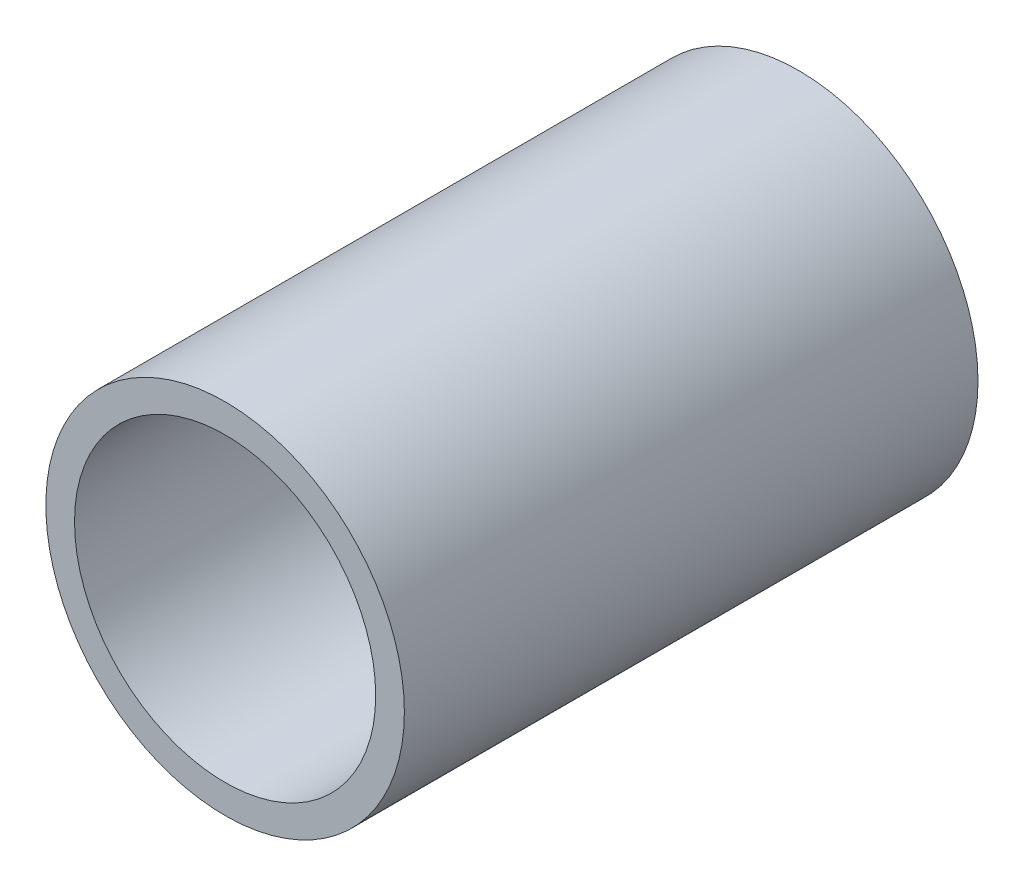
ISO-10303-21;
HEADER;
FILE_DESCRIPTION(('STEP AP214'),'2;1');
FILE_NAME('part.step','',(''),(''),'','','');
FILE_SCHEMA(('AUTOMOTIVE_DESIGN { 1 0 10303 214 1 1 1 1 }'));
ENDSEC;
DATA;
#1=APPLICATION_CONTEXT('core data for automotive mechanical design processes');
#2=APPLICATION_PROTOCOL_DEFINITION('international standard','automotive_design',2000,#1);
#3=PRODUCT_CONTEXT('',#1,'mechanical');
#4=PRODUCT('Part','Part','',(#3));
#5=PRODUCT_RELATED_PRODUCT_CATEGORY('part','',(#4));
#6=PRODUCT_DEFINITION_FORMATION('','',#4);
#7=PRODUCT_DEFINITION_CONTEXT('part definition',#1,'design');
#8=PRODUCT_DEFINITION('design','',#6,#7);
#9=PRODUCT_DEFINITION_SHAPE('','',#8);
#10=(LENGTH_UNIT() NAMED_UNIT(*) SI_UNIT(.MILLI.,.METRE.));
#11=(NAMED_UNIT(*) PLANE_ANGLE_UNIT() SI_UNIT($,.RADIAN.));
#12=(NAMED_UNIT(*) SI_UNIT($,.STERADIAN.) SOLID_ANGLE_UNIT());
#13=UNCERTAINTY_MEASURE_WITH_UNIT(LENGTH_MEASURE(1.E-05),#10,'distance_accuracy_value','');
#14=(GEOMETRIC_REPRESENTATION_CONTEXT(3) GLOBAL_UNCERTAINTY_ASSIGNED_CONTEXT((#13)) GLOBAL_UNIT_ASSIGNED_CONTEXT((#10,
#11,#12)) REPRESENTATION_CONTEXT('',''));
#15=CARTESIAN_POINT('',(0.,0.,0.));
#16=DIRECTION('',(0.,0.,1.));
#17=DIRECTION('',(1.,0.,0.));
#18=AXIS2_PLACEMENT_3D('',#15,#16,#17);
#19=CARTESIAN_POINT('',(0.,0.,12.));
#20=DIRECTION('',(0.,0.,1.));
#21=DIRECTION('',(1.,0.,0.));
#22=AXIS2_PLACEMENT_3D('',#19,#20,#21);
#23=PLANE('',#22);
#24=CARTESIAN_POINT('',(0.,0.,12.));
#25=DIRECTION('',(0.,0.,1.));
#26=DIRECTION('',(1.,0.,0.));
#27=AXIS2_PLACEMENT_3D('',#24,#25,#26);
#28=CIRCLE('',#27,3.75);
#29=CARTESIAN_POINT('',(3.75,0.,12.));
#30=VERTEX_POINT('',#29);
#31=EDGE_CURVE('E10',#30,#30,#28,.T.);
#32=ORIENTED_EDGE('',*,*,#31,.T.);
#33=EDGE_LOOP('',(#32));
#34=FACE_BOUND('',#33,.T.);
#35=CARTESIAN_POINT('',(0.,0.,12.));
#36=DIRECTION('',(0.,0.,1.));
#37=DIRECTION('',(1.,0.,0.));
#38=AXIS2_PLACEMENT_3D('',#35,#36,#37);
#39=CIRCLE('',#38,3.15);
#40=CARTESIAN_POINT('',(3.15,0.,12.));
#41=VERTEX_POINT('',#40);
#42=EDGE_CURVE('E42',#41,#41,#39,.T.);
#43=ORIENTED_EDGE('',*,*,#42,.F.);
#44=EDGE_LOOP('',(#43));
#45=FACE_BOUND('',#44,.T.);
#46=ADVANCED_FACE('F31',(#34,#45),#23,.T.);
#47=CARTESIAN_POINT('',(0.,0.,0.));
#48=DIRECTION('',(0.,0.,1.));
#49=DIRECTION('',(1.,0.,0.));
#50=AXIS2_PLACEMENT_3D('',#47,#48,#49);
#51=PLANE('',#50);
#52=CARTESIAN_POINT('',(0.,0.,0.));
#53=DIRECTION('',(0.,0.,1.));
#54=DIRECTION('',(1.,0.,0.));
#55=AXIS2_PLACEMENT_3D('',#52,#53,#54);
#56=CIRCLE('',#55,3.75);
#57=CARTESIAN_POINT('',(3.75,0.,0.));
#58=VERTEX_POINT('',#57);
#59=EDGE_CURVE('E35',#58,#58,#56,.T.);
#60=ORIENTED_EDGE('',*,*,#59,.F.);
#61=EDGE_LOOP('',(#60));
#62=FACE_BOUND('',#61,.T.);
#63=CARTESIAN_POINT('',(0.,0.,0.));
#64=DIRECTION('',(0.,0.,1.));
#65=DIRECTION('',(1.,0.,0.));
#66=AXIS2_PLACEMENT_3D('',#63,#64,#65);
#67=CIRCLE('',#66,3.15);
#68=CARTESIAN_POINT('',(3.15,0.,0.));
#69=VERTEX_POINT('',#68);
#70=EDGE_CURVE('E44',#69,#69,#67,.T.);
#71=ORIENTED_EDGE('',*,*,#70,.T.);
#72=EDGE_LOOP('',(#71));
#73=FACE_BOUND('',#72,.T.);
#74=ADVANCED_FACE('F54',(#62,#73),#51,.F.);
#75=CARTESIAN_POINT('',(0.,0.,12.));
#76=DIRECTION('',(0.,0.,-1.));
#77=DIRECTION('',(-1.,0.,0.));
#78=AXIS2_PLACEMENT_3D('',#75,#76,#77);
#79=CYLINDRICAL_SURFACE('',#78,3.75);
#80=ORIENTED_EDGE('',*,*,#31,.F.);
#81=EDGE_LOOP('',(#80));
#82=FACE_BOUND('',#81,.T.);
#83=ORIENTED_EDGE('',*,*,#59,.T.);
#84=EDGE_LOOP('',(#83));
#85=FACE_BOUND('',#84,.T.);
#86=ADVANCED_FACE('F33',(#82,#85),#79,.T.);
#87=CARTESIAN_POINT('',(0.,0.,12.));
#88=DIRECTION('',(0.,0.,-1.));
#89=DIRECTION('',(-1.,0.,0.));
#90=AXIS2_PLACEMENT_3D('',#87,#88,#89);
#91=CYLINDRICAL_SURFACE('',#90,3.15);
#92=ORIENTED_EDGE('',*,*,#42,.T.);
#93=EDGE_LOOP('',(#92));
#94=FACE_BOUND('',#93,.T.);
#95=ORIENTED_EDGE('',*,*,#70,.F.);
#96=EDGE_LOOP('',(#95));
#97=FACE_BOUND('',#96,.T.);
#98=ADVANCED_FACE('F50',(#94,#97),#91,.F.);
#99=CLOSED_SHELL('',(#46,#74,#86,#98));
#100=MANIFOLD_SOLID_BREP('B2',#99);
#101=ADVANCED_BREP_SHAPE_REPRESENTATION('',(#18,#100),#14);
#102=SHAPE_DEFINITION_REPRESENTATION(#9,#101);
ENDSEC;
END-ISO-10303-21;
